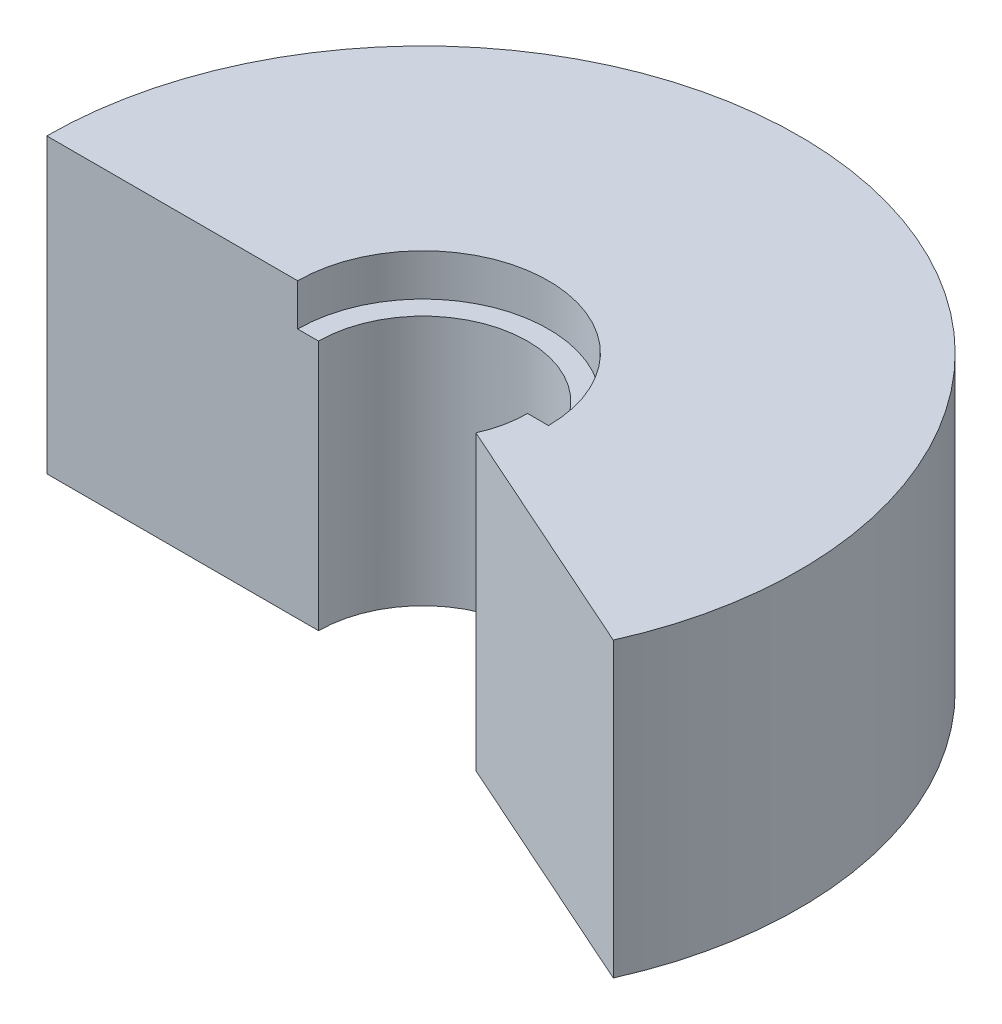
ISO-10303-21;
HEADER;
FILE_DESCRIPTION(('STEP AP214'),'2;1');
FILE_NAME('part.step','',(''),(''),'','','');
FILE_SCHEMA(('AUTOMOTIVE_DESIGN { 1 0 10303 214 1 1 1 1 }'));
ENDSEC;
DATA;
#1=APPLICATION_CONTEXT('core data for automotive mechanical design processes');
#2=APPLICATION_PROTOCOL_DEFINITION('international standard','automotive_design',2000,#1);
#3=PRODUCT_CONTEXT('',#1,'mechanical');
#4=PRODUCT('Part','Part','',(#3));
#5=PRODUCT_RELATED_PRODUCT_CATEGORY('part','',(#4));
#6=PRODUCT_DEFINITION_FORMATION('','',#4);
#7=PRODUCT_DEFINITION_CONTEXT('part definition',#1,'design');
#8=PRODUCT_DEFINITION('design','',#6,#7);
#9=PRODUCT_DEFINITION_SHAPE('','',#8);
#10=(LENGTH_UNIT() NAMED_UNIT(*) SI_UNIT(.MILLI.,.METRE.));
#11=(NAMED_UNIT(*) PLANE_ANGLE_UNIT() SI_UNIT($,.RADIAN.));
#12=(NAMED_UNIT(*) SI_UNIT($,.STERADIAN.) SOLID_ANGLE_UNIT());
#13=UNCERTAINTY_MEASURE_WITH_UNIT(LENGTH_MEASURE(1.E-05),#10,'distance_accuracy_value','');
#14=(GEOMETRIC_REPRESENTATION_CONTEXT(3) GLOBAL_UNCERTAINTY_ASSIGNED_CONTEXT((#13)) GLOBAL_UNIT_ASSIGNED_CONTEXT((#10,
#11,#12)) REPRESENTATION_CONTEXT('',''));
#15=CARTESIAN_POINT('',(0.,0.,0.));
#16=DIRECTION('',(0.,0.,1.));
#17=DIRECTION('',(1.,0.,0.));
#18=AXIS2_PLACEMENT_3D('',#15,#16,#17);
#19=CARTESIAN_POINT('',(0.,7.,0.));
#20=DIRECTION('',(0.,1.,0.));
#21=DIRECTION('',(0.,0.,1.));
#22=AXIS2_PLACEMENT_3D('',#19,#20,#21);
#23=PLANE('',#22);
#24=DIRECTION('',(-1.,0.,0.));
#25=VECTOR('',#24,1.);
#26=CARTESIAN_POINT('',(0.,7.,0.));
#27=LINE('',#26,#25);
#28=CARTESIAN_POINT('',(-3.,7.,0.));
#29=VERTEX_POINT('',#28);
#30=CARTESIAN_POINT('',(-9.,7.,0.));
#31=VERTEX_POINT('',#30);
#32=EDGE_CURVE('E152',#29,#31,#27,.T.);
#33=ORIENTED_EDGE('',*,*,#32,.F.);
#34=CARTESIAN_POINT('',(0.,7.,0.));
#35=DIRECTION('',(0.,1.,0.));
#36=DIRECTION('',(0.,0.,1.));
#37=AXIS2_PLACEMENT_3D('',#34,#35,#36);
#38=CIRCLE('',#37,3.);
#39=CARTESIAN_POINT('',(3.,7.,0.));
#40=VERTEX_POINT('',#39);
#41=EDGE_CURVE('E167',#29,#40,#38,.F.);
#42=ORIENTED_EDGE('',*,*,#41,.T.);
#43=DIRECTION('',(1.,0.,0.));
#44=VECTOR('',#43,1.);
#45=CARTESIAN_POINT('',(0.,7.,0.));
#46=LINE('',#45,#44);
#47=CARTESIAN_POINT('',(2.5,7.,0.));
#48=VERTEX_POINT('',#47);
#49=EDGE_CURVE('E163',#48,#40,#46,.T.);
#50=ORIENTED_EDGE('',*,*,#49,.F.);
#51=CARTESIAN_POINT('',(0.,7.,0.));
#52=DIRECTION('',(0.,1.,0.));
#53=DIRECTION('',(0.,0.,1.));
#54=AXIS2_PLACEMENT_3D('',#51,#52,#53);
#55=CIRCLE('',#54,2.5);
#56=CARTESIAN_POINT('',(2.28284990235858,7.,1.01911546122185));
#57=VERTEX_POINT('',#56);
#58=EDGE_CURVE('E130',#57,#48,#55,.T.);
#59=ORIENTED_EDGE('',*,*,#58,.F.);
#60=DIRECTION('',(0.913139960943431,0.,0.407646184488742));
#61=VECTOR('',#60,1.);
#62=CARTESIAN_POINT('',(0.,7.,0.));
#63=LINE('',#62,#61);
#64=CARTESIAN_POINT('',(8.21825964849088,7.,3.66881566039868));
#65=VERTEX_POINT('',#64);
#66=EDGE_CURVE('E146',#57,#65,#63,.T.);
#67=ORIENTED_EDGE('',*,*,#66,.T.);
#68=CARTESIAN_POINT('',(0.,7.,0.));
#69=DIRECTION('',(0.,1.,0.));
#70=DIRECTION('',(0.,0.,1.));
#71=AXIS2_PLACEMENT_3D('',#68,#69,#70);
#72=CIRCLE('',#71,9.);
#73=EDGE_CURVE('E121',#65,#31,#72,.T.);
#74=ORIENTED_EDGE('',*,*,#73,.T.);
#75=EDGE_LOOP('',(#33,#42,#50,#59,#67,#74));
#76=FACE_BOUND('',#75,.T.);
#77=ADVANCED_FACE('F43',(#76),#23,.T.);
#78=CARTESIAN_POINT('',(0.,-7.00000000000001,0.));
#79=DIRECTION('',(0.,0.,-1.));
#80=DIRECTION('',(-1.,0.,0.));
#81=AXIS2_PLACEMENT_3D('',#78,#79,#80);
#82=PLANE('',#81);
#83=DIRECTION('',(0.,1.,0.));
#84=VECTOR('',#83,1.);
#85=CARTESIAN_POINT('',(-3.,6.,0.));
#86=LINE('',#85,#84);
#87=CARTESIAN_POINT('',(-3.,6.,0.));
#88=VERTEX_POINT('',#87);
#89=EDGE_CURVE('E156',#88,#29,#86,.T.);
#90=ORIENTED_EDGE('',*,*,#89,.T.);
#91=ORIENTED_EDGE('',*,*,#32,.T.);
#92=DIRECTION('',(0.,1.,0.));
#93=VECTOR('',#92,1.);
#94=CARTESIAN_POINT('',(-9.,-7.00000000000001,0.));
#95=LINE('',#94,#93);
#96=CARTESIAN_POINT('',(-9.,0.,0.));
#97=VERTEX_POINT('',#96);
#98=EDGE_CURVE('E142',#97,#31,#95,.T.);
#99=ORIENTED_EDGE('',*,*,#98,.F.);
#100=DIRECTION('',(-1.,0.,0.));
#101=VECTOR('',#100,1.);
#102=CARTESIAN_POINT('',(0.,0.,0.));
#103=LINE('',#102,#101);
#104=CARTESIAN_POINT('',(-2.5,0.,0.));
#105=VERTEX_POINT('',#104);
#106=EDGE_CURVE('E118',#105,#97,#103,.T.);
#107=ORIENTED_EDGE('',*,*,#106,.F.);
#108=DIRECTION('',(0.,1.,0.));
#109=VECTOR('',#108,1.);
#110=CARTESIAN_POINT('',(-2.5,-4.,0.));
#111=LINE('',#110,#109);
#112=CARTESIAN_POINT('',(-2.5,6.,0.));
#113=VERTEX_POINT('',#112);
#114=EDGE_CURVE('E52',#113,#105,#111,.F.);
#115=ORIENTED_EDGE('',*,*,#114,.F.);
#116=DIRECTION('',(1.,0.,0.));
#117=VECTOR('',#116,1.);
#118=CARTESIAN_POINT('',(0.,6.,0.));
#119=LINE('',#118,#117);
#120=EDGE_CURVE('E101',#88,#113,#119,.T.);
#121=ORIENTED_EDGE('',*,*,#120,.F.);
#122=EDGE_LOOP('',(#90,#91,#99,#107,#115,#121));
#123=FACE_BOUND('',#122,.T.);
#124=ADVANCED_FACE('F116',(#123),#82,.F.);
#125=CARTESIAN_POINT('',(0.,7.,0.));
#126=DIRECTION('',(0.,-1.,0.));
#127=DIRECTION('',(0.,0.,-1.));
#128=AXIS2_PLACEMENT_3D('',#125,#126,#127);
#129=CYLINDRICAL_SURFACE('',#128,9.);
#130=DIRECTION('',(0.,1.,0.));
#131=VECTOR('',#130,1.);
#132=CARTESIAN_POINT('',(8.21825964849088,-7.00000000000001,3.66881566039868));
#133=LINE('',#132,#131);
#134=CARTESIAN_POINT('',(8.21825964849088,0.,3.66881566039868));
#135=VERTEX_POINT('',#134);
#136=EDGE_CURVE('E141',#135,#65,#133,.T.);
#137=ORIENTED_EDGE('',*,*,#136,.F.);
#138=CARTESIAN_POINT('',(0.,0.,0.));
#139=DIRECTION('',(0.,1.,0.));
#140=DIRECTION('',(0.,0.,1.));
#141=AXIS2_PLACEMENT_3D('',#138,#139,#140);
#142=CIRCLE('',#141,9.);
#143=EDGE_CURVE('E124',#135,#97,#142,.T.);
#144=ORIENTED_EDGE('',*,*,#143,.T.);
#145=ORIENTED_EDGE('',*,*,#98,.T.);
#146=ORIENTED_EDGE('',*,*,#73,.F.);
#147=EDGE_LOOP('',(#137,#144,#145,#146));
#148=FACE_BOUND('',#147,.T.);
#149=ADVANCED_FACE('F45',(#148),#129,.T.);
#150=CARTESIAN_POINT('',(0.,0.,0.));
#151=DIRECTION('',(0.,1.,0.));
#152=DIRECTION('',(0.,0.,1.));
#153=AXIS2_PLACEMENT_3D('',#150,#151,#152);
#154=PLANE('',#153);
#155=DIRECTION('',(0.913139960943431,0.,0.407646184488742));
#156=VECTOR('',#155,1.);
#157=CARTESIAN_POINT('',(0.,0.,0.));
#158=LINE('',#157,#156);
#159=CARTESIAN_POINT('',(2.28284990235858,0.,1.01911546122185));
#160=VERTEX_POINT('',#159);
#161=EDGE_CURVE('E136',#160,#135,#158,.T.);
#162=ORIENTED_EDGE('',*,*,#161,.F.);
#163=CARTESIAN_POINT('',(0.,0.,0.));
#164=DIRECTION('',(0.,1.,0.));
#165=DIRECTION('',(0.,0.,1.));
#166=AXIS2_PLACEMENT_3D('',#163,#164,#165);
#167=CIRCLE('',#166,2.5);
#168=EDGE_CURVE('E127',#160,#105,#167,.T.);
#169=ORIENTED_EDGE('',*,*,#168,.T.);
#170=ORIENTED_EDGE('',*,*,#106,.T.);
#171=ORIENTED_EDGE('',*,*,#143,.F.);
#172=EDGE_LOOP('',(#162,#169,#170,#171));
#173=FACE_BOUND('',#172,.T.);
#174=ADVANCED_FACE('F192',(#173),#154,.F.);
#175=CARTESIAN_POINT('',(0.,-4.,0.));
#176=DIRECTION('',(0.,1.,0.));
#177=DIRECTION('',(0.,0.,1.));
#178=AXIS2_PLACEMENT_3D('',#175,#176,#177);
#179=CYLINDRICAL_SURFACE('',#178,2.5);
#180=ORIENTED_EDGE('',*,*,#58,.T.);
#181=DIRECTION('',(0.,1.,0.));
#182=VECTOR('',#181,1.);
#183=CARTESIAN_POINT('',(2.5,6.,0.));
#184=LINE('',#183,#182);
#185=CARTESIAN_POINT('',(2.5,6.,0.));
#186=VERTEX_POINT('',#185);
#187=EDGE_CURVE('E112',#186,#48,#184,.T.);
#188=ORIENTED_EDGE('',*,*,#187,.F.);
#189=CARTESIAN_POINT('',(0.,6.,0.));
#190=DIRECTION('',(0.,1.,0.));
#191=DIRECTION('',(0.,0.,1.));
#192=AXIS2_PLACEMENT_3D('',#189,#190,#191);
#193=CIRCLE('',#192,2.5);
#194=EDGE_CURVE('E103',#113,#186,#193,.F.);
#195=ORIENTED_EDGE('',*,*,#194,.F.);
#196=ORIENTED_EDGE('',*,*,#114,.T.);
#197=ORIENTED_EDGE('',*,*,#168,.F.);
#198=DIRECTION('',(0.,1.,0.));
#199=VECTOR('',#198,1.);
#200=CARTESIAN_POINT('',(2.28284990235858,-4.,1.01911546122185));
#201=LINE('',#200,#199);
#202=EDGE_CURVE('E11',#57,#160,#201,.F.);
#203=ORIENTED_EDGE('',*,*,#202,.F.);
#204=EDGE_LOOP('',(#180,#188,#195,#196,#197,#203));
#205=FACE_BOUND('',#204,.T.);
#206=ADVANCED_FACE('F111',(#205),#179,.F.);
#207=CARTESIAN_POINT('',(0.,-7.00000000000001,0.));
#208=DIRECTION('',(-0.407646184488742,0.,0.913139960943431));
#209=DIRECTION('',(0.913139960943431,0.,0.407646184488742));
#210=AXIS2_PLACEMENT_3D('',#207,#208,#209);
#211=PLANE('',#210);
#212=ORIENTED_EDGE('',*,*,#161,.T.);
#213=ORIENTED_EDGE('',*,*,#136,.T.);
#214=ORIENTED_EDGE('',*,*,#66,.F.);
#215=ORIENTED_EDGE('',*,*,#202,.T.);
#216=EDGE_LOOP('',(#212,#213,#214,#215));
#217=FACE_BOUND('',#216,.T.);
#218=ADVANCED_FACE('F189',(#217),#211,.T.);
#219=CARTESIAN_POINT('',(0.,6.,0.));
#220=DIRECTION('',(0.,1.,0.));
#221=DIRECTION('',(0.,0.,1.));
#222=AXIS2_PLACEMENT_3D('',#219,#220,#221);
#223=CYLINDRICAL_SURFACE('',#222,3.);
#224=ORIENTED_EDGE('',*,*,#41,.F.);
#225=ORIENTED_EDGE('',*,*,#89,.F.);
#226=CARTESIAN_POINT('',(0.,6.,0.));
#227=DIRECTION('',(0.,1.,0.));
#228=DIRECTION('',(0.,0.,1.));
#229=AXIS2_PLACEMENT_3D('',#226,#227,#228);
#230=CIRCLE('',#229,3.);
#231=CARTESIAN_POINT('',(3.,6.,0.));
#232=VERTEX_POINT('',#231);
#233=EDGE_CURVE('E59',#88,#232,#230,.F.);
#234=ORIENTED_EDGE('',*,*,#233,.T.);
#235=DIRECTION('',(0.,1.,0.));
#236=VECTOR('',#235,1.);
#237=CARTESIAN_POINT('',(3.,6.,0.));
#238=LINE('',#237,#236);
#239=EDGE_CURVE('E155',#232,#40,#238,.T.);
#240=ORIENTED_EDGE('',*,*,#239,.T.);
#241=EDGE_LOOP('',(#224,#225,#234,#240));
#242=FACE_BOUND('',#241,.T.);
#243=ADVANCED_FACE('F176',(#242),#223,.F.);
#244=CARTESIAN_POINT('',(0.,6.,0.));
#245=DIRECTION('',(0.,0.,1.));
#246=DIRECTION('',(1.,0.,0.));
#247=AXIS2_PLACEMENT_3D('',#244,#245,#246);
#248=PLANE('',#247);
#249=ORIENTED_EDGE('',*,*,#49,.T.);
#250=ORIENTED_EDGE('',*,*,#239,.F.);
#251=DIRECTION('',(1.,0.,0.));
#252=VECTOR('',#251,1.);
#253=CARTESIAN_POINT('',(0.,6.,0.));
#254=LINE('',#253,#252);
#255=EDGE_CURVE('E114',#186,#232,#254,.T.);
#256=ORIENTED_EDGE('',*,*,#255,.F.);
#257=ORIENTED_EDGE('',*,*,#187,.T.);
#258=EDGE_LOOP('',(#249,#250,#256,#257));
#259=FACE_BOUND('',#258,.T.);
#260=ADVANCED_FACE('F178',(#259),#248,.F.);
#261=CARTESIAN_POINT('',(0.,6.,0.));
#262=DIRECTION('',(0.,1.,0.));
#263=DIRECTION('',(0.,0.,1.));
#264=AXIS2_PLACEMENT_3D('',#261,#262,#263);
#265=PLANE('',#264);
#266=ORIENTED_EDGE('',*,*,#233,.F.);
#267=ORIENTED_EDGE('',*,*,#120,.T.);
#268=ORIENTED_EDGE('',*,*,#194,.T.);
#269=ORIENTED_EDGE('',*,*,#255,.T.);
#270=EDGE_LOOP('',(#266,#267,#268,#269));
#271=FACE_BOUND('',#270,.T.);
#272=ADVANCED_FACE('F102',(#271),#265,.T.);
#273=CLOSED_SHELL('',(#77,#124,#149,#174,#206,#218,#243,#260,#272));
#274=MANIFOLD_SOLID_BREP('B2',#273);
#275=ADVANCED_BREP_SHAPE_REPRESENTATION('',(#18,#274),#14);
#276=SHAPE_DEFINITION_REPRESENTATION(#9,#275);
ENDSEC;
END-ISO-10303-21;
